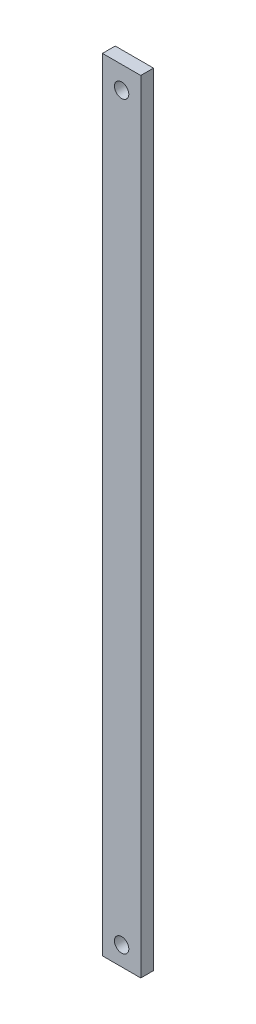
ISO-10303-21;
HEADER;
FILE_DESCRIPTION(('STEP AP214'),'2;1');
FILE_NAME('part.step','',(''),(''),'','','');
FILE_SCHEMA(('AUTOMOTIVE_DESIGN { 1 0 10303 214 1 1 1 1 }'));
ENDSEC;
DATA;
#1=APPLICATION_CONTEXT('core data for automotive mechanical design processes');
#2=APPLICATION_PROTOCOL_DEFINITION('international standard','automotive_design',2000,#1);
#3=PRODUCT_CONTEXT('',#1,'mechanical');
#4=PRODUCT('Part','Part','',(#3));
#5=PRODUCT_RELATED_PRODUCT_CATEGORY('part','',(#4));
#6=PRODUCT_DEFINITION_FORMATION('','',#4);
#7=PRODUCT_DEFINITION_CONTEXT('part definition',#1,'design');
#8=PRODUCT_DEFINITION('design','',#6,#7);
#9=PRODUCT_DEFINITION_SHAPE('','',#8);
#10=(LENGTH_UNIT() NAMED_UNIT(*) SI_UNIT(.MILLI.,.METRE.));
#11=(NAMED_UNIT(*) PLANE_ANGLE_UNIT() SI_UNIT($,.RADIAN.));
#12=(NAMED_UNIT(*) SI_UNIT($,.STERADIAN.) SOLID_ANGLE_UNIT());
#13=UNCERTAINTY_MEASURE_WITH_UNIT(LENGTH_MEASURE(1.E-05),#10,'distance_accuracy_value','');
#14=(GEOMETRIC_REPRESENTATION_CONTEXT(3) GLOBAL_UNCERTAINTY_ASSIGNED_CONTEXT((#13)) GLOBAL_UNIT_ASSIGNED_CONTEXT((#10,
#11,#12)) REPRESENTATION_CONTEXT('',''));
#15=CARTESIAN_POINT('',(0.,0.,0.));
#16=DIRECTION('',(0.,0.,1.));
#17=DIRECTION('',(1.,0.,0.));
#18=AXIS2_PLACEMENT_3D('',#15,#16,#17);
#19=CARTESIAN_POINT('',(0.,0.,0.));
#20=DIRECTION('',(0.,0.,-1.));
#21=DIRECTION('',(-1.,0.,0.));
#22=AXIS2_PLACEMENT_3D('',#19,#20,#21);
#23=PLANE('',#22);
#24=CARTESIAN_POINT('',(8.25,238.,0.));
#25=CARTESIAN_POINT('',(8.25000287090614,238.03711210073,0.));
#26=CARTESIAN_POINT('',(8.24911578489817,238.074226085527,0.));
#27=CARTESIAN_POINT('',(8.24554467484645,238.148103928321,0.));
#28=CARTESIAN_POINT('',(8.24287341102427,238.184868405459,0.));
#29=CARTESIAN_POINT('',(8.23573462791084,238.258047699601,0.));
#30=CARTESIAN_POINT('',(8.23127566323488,238.294463347968,0.));
#31=CARTESIAN_POINT('',(8.22056672731365,238.366944561543,0.));
#32=CARTESIAN_POINT('',(8.21432091396728,238.403010740813,0.));
#33=CARTESIAN_POINT('',(8.20004247191825,238.474793377988,0.));
#34=CARTESIAN_POINT('',(8.19200957098616,238.510509781747,0.));
#35=CARTESIAN_POINT('',(8.17416159650008,238.5815936297,0.));
#36=CARTESIAN_POINT('',(8.16434191407373,238.616959916075,0.));
#37=CARTESIAN_POINT('',(8.14292421865261,238.687344604515,0.));
#38=CARTESIAN_POINT('',(8.13131747701691,238.722360348466,0.));
#39=CARTESIAN_POINT('',(8.10633144178983,238.792045947027,0.));
#40=CARTESIAN_POINT('',(8.09293964424512,238.826711312357,0.));
#41=CARTESIAN_POINT('',(8.06454006705624,238.895311438424,0.));
#42=CARTESIAN_POINT('',(8.04953479968317,238.92924723903,0.));
#43=CARTESIAN_POINT('',(8.01799013304355,238.99611117842,0.));
#44=CARTESIAN_POINT('',(8.00146210911647,239.02904467768,0.));
#45=CARTESIAN_POINT('',(7.96687764173627,239.093905522552,0.));
#46=CARTESIAN_POINT('',(7.94882855829296,239.125836791035,0.));
#47=CARTESIAN_POINT('',(7.91120560897921,239.188694601239,0.));
#48=CARTESIAN_POINT('',(7.89163512149589,239.219623164542,0.));
#49=CARTESIAN_POINT('',(7.85097346813862,239.280477572315,0.));
#50=CARTESIAN_POINT('',(7.82988184069663,239.310403108362,0.));
#51=CARTESIAN_POINT('',(7.78618182500541,239.369253961589,0.));
#52=CARTESIAN_POINT('',(7.76356939515893,239.398176276876,0.));
#53=CARTESIAN_POINT('',(7.7168308634221,239.455023101906,0.));
#54=CARTESIAN_POINT('',(7.69269749744769,239.482941636499,0.));
#55=CARTESIAN_POINT('',(7.64292190997976,239.53778521661,0.));
#56=CARTESIAN_POINT('',(7.61726965377244,239.564701146949,0.));
#57=CARTESIAN_POINT('',(7.5647652379527,239.617224971904,0.));
#58=CARTESIAN_POINT('',(7.53791567096607,239.642835457821,0.));
#59=CARTESIAN_POINT('',(7.48318459423319,239.692538178883,0.));
#60=CARTESIAN_POINT('',(7.45531154398212,239.716639721036,0.));
#61=CARTESIAN_POINT('',(7.39853846059551,239.76332839421,0.));
#62=CARTESIAN_POINT('',(7.36964372575687,239.785921965796,0.));
#63=CARTESIAN_POINT('',(7.31083001866806,239.829597339041,0.));
#64=CARTESIAN_POINT('',(7.280913394046,239.850682301281,0.));
#65=CARTESIAN_POINT('',(7.22005894888905,239.891343899786,0.));
#66=CARTESIAN_POINT('',(7.18912081995047,239.910920074472,0.));
#67=CARTESIAN_POINT('',(7.12622602396911,239.948567901838,0.));
#68=CARTESIAN_POINT('',(7.09426677174845,239.966635234479,0.));
#69=CARTESIAN_POINT('',(7.0293316606141,240.001268790702,0.));
#70=CARTESIAN_POINT('',(6.99635137715341,240.017826714125,0.));
#71=CARTESIAN_POINT('',(6.92937700123519,240.049447282664,0.));
#72=CARTESIAN_POINT('',(6.89537712613848,240.064497666334,0.));
#73=CARTESIAN_POINT('',(6.82676937336938,240.092930783108,0.));
#74=CARTESIAN_POINT('',(6.79216289932262,240.106316902417,0.));
#75=CARTESIAN_POINT('',(6.72257756984626,240.131291552819,0.));
#76=CARTESIAN_POINT('',(6.68760296833329,240.142891919775,0.));
#77=CARTESIAN_POINT('',(6.61728449689123,240.164300510904,0.));
#78=CARTESIAN_POINT('',(6.58194305725306,240.174116712953,0.));
#79=CARTESIAN_POINT('',(6.51089243529977,240.191960465071,0.));
#80=CARTESIAN_POINT('',(6.47518421240803,240.199991833533,0.));
#81=CARTESIAN_POINT('',(6.4034015159838,240.214270264204,0.));
#82=CARTESIAN_POINT('',(6.36732693416212,240.220516781947,0.));
#83=CARTESIAN_POINT('',(6.29481251965567,240.23123004269,0.));
#84=CARTESIAN_POINT('',(6.25837195178599,240.235691805188,0.));
#85=CARTESIAN_POINT('',(6.18512604349686,240.242839447711,0.));
#86=CARTESIAN_POINT('',(6.14831979166278,240.245515966187,0.));
#87=CARTESIAN_POINT('',(6.07434286884701,240.249099578209,0.));
#88=CARTESIAN_POINT('',(6.03717154765592,240.249993130735,0.));
#89=CARTESIAN_POINT('',(5.96290536637939,240.250006855051,0.));
#90=CARTESIAN_POINT('',(5.92581050723018,240.24913069243,0.));
#91=CARTESIAN_POINT('',(5.8519646606233,240.245575108041,0.));
#92=CARTESIAN_POINT('',(5.81521307388341,240.242908249088,0.));
#93=CARTESIAN_POINT('',(5.74205456422342,240.235777494242,0.));
#94=CARTESIAN_POINT('',(5.70564683359849,240.231321898977,0.));
#95=CARTESIAN_POINT('',(5.63317610989629,240.22061748046,0.));
#96=CARTESIAN_POINT('',(5.59711254197413,240.214372552101,0.));
#97=CARTESIAN_POINT('',(5.52532985910152,240.200094053302,0.));
#98=CARTESIAN_POINT('',(5.48961085246244,240.192059938402,0.));
#99=CARTESIAN_POINT('',(5.41851648169572,240.17420763569,0.));
#100=CARTESIAN_POINT('',(5.38314234430141,240.164384565151,0.));
#101=CARTESIAN_POINT('',(5.31273666442082,240.142958130193,0.));
#102=CARTESIAN_POINT('',(5.27770786240688,240.131345768047,0.));
#103=CARTESIAN_POINT('',(5.20799070859296,240.106346851108,0.));
#104=CARTESIAN_POINT('',(5.17330693800182,240.09294753722,0.));
#105=CARTESIAN_POINT('',(5.10468868109664,240.064539779675,0.));
#106=CARTESIAN_POINT('',(5.07075279288692,240.049534722941,0.));
#107=CARTESIAN_POINT('',(5.00388878988494,240.017990209252,0.));
#108=CARTESIAN_POINT('',(4.97095531384687,240.001462129491,0.));
#109=CARTESIAN_POINT('',(4.90609448588364,239.966877621453,0.));
#110=CARTESIAN_POINT('',(4.87416321122364,239.948828552863,0.));
#111=CARTESIAN_POINT('',(4.8113053965087,239.911205614395,0.));
#112=CARTESIAN_POINT('',(4.78037683485551,239.891635122947,0.));
#113=CARTESIAN_POINT('',(4.71952242829024,239.850973466685,0.));
#114=CARTESIAN_POINT('',(4.68959689180065,239.829881840306,0.));
#115=CARTESIAN_POINT('',(4.63074603824958,239.786181825395,0.));
#116=CARTESIAN_POINT('',(4.60182372308062,239.763569395263,0.));
#117=CARTESIAN_POINT('',(4.54497689813882,239.716830863316,0.));
#118=CARTESIAN_POINT('',(4.51705836351321,239.692697497419,0.));
#119=CARTESIAN_POINT('',(4.46221478337795,239.642921910008,0.));
#120=CARTESIAN_POINT('',(4.43529885304788,239.61726965378,0.));
#121=CARTESIAN_POINT('',(4.38277502809922,239.564765237945,0.));
#122=CARTESIAN_POINT('',(4.35716454217892,239.537915670964,0.));
#123=CARTESIAN_POINT('',(4.30746182111449,239.483184594235,0.));
#124=CARTESIAN_POINT('',(4.28336027896206,239.455311543982,0.));
#125=CARTESIAN_POINT('',(4.23667160578767,239.398538460595,0.));
#126=CARTESIAN_POINT('',(4.21407803420168,239.369643725756,0.));
#127=CARTESIAN_POINT('',(4.17040266095661,239.310830018668,0.));
#128=CARTESIAN_POINT('',(4.14931769871595,239.280913394046,0.));
#129=CARTESIAN_POINT('',(4.10865610021102,239.220058948889,0.));
#130=CARTESIAN_POINT('',(4.08907992552584,239.18912081995,0.));
#131=CARTESIAN_POINT('',(4.05143209815946,239.126226023969,0.));
#132=CARTESIAN_POINT('',(4.03336476551906,239.094266771748,0.));
#133=CARTESIAN_POINT('',(3.99873120929612,239.029331660614,0.));
#134=CARTESIAN_POINT('',(3.98217328587373,238.996351377153,0.));
#135=CARTESIAN_POINT('',(3.95055271733512,238.929377001235,0.));
#136=CARTESIAN_POINT('',(3.93550233366577,238.895377126138,0.));
#137=CARTESIAN_POINT('',(3.90706921689241,238.826769373369,0.));
#138=CARTESIAN_POINT('',(3.89368309758285,238.792162899321,0.));
#139=CARTESIAN_POINT('',(3.86870844718104,238.722577569844,0.));
#140=CARTESIAN_POINT('',(3.85710808022563,238.687602968331,0.));
#141=CARTESIAN_POINT('',(3.83569948909653,238.617284496888,0.));
#142=CARTESIAN_POINT('',(3.82588328704712,238.581943057249,0.));
#143=CARTESIAN_POINT('',(3.80803953493,238.510892435296,0.));
#144=CARTESIAN_POINT('',(3.80000816646727,238.475184212404,0.));
#145=CARTESIAN_POINT('',(3.78572973579673,238.40340151598,0.));
#146=CARTESIAN_POINT('',(3.77948321805338,238.367326934158,0.));
#147=CARTESIAN_POINT('',(3.76876995731007,238.294812519652,0.));
#148=CARTESIAN_POINT('',(3.76430819481213,238.258371951783,0.));
#149=CARTESIAN_POINT('',(3.75716055228951,238.185126043494,0.));
#150=CARTESIAN_POINT('',(3.75448403381372,238.14831979166,0.));
#151=CARTESIAN_POINT('',(3.75090042179132,238.074342868846,0.));
#152=CARTESIAN_POINT('',(3.7500068692647,238.037171547655,0.));
#153=CARTESIAN_POINT('',(3.74999314494893,237.96290536638,0.));
#154=CARTESIAN_POINT('',(3.75086930756954,237.925810507232,0.));
#155=CARTESIAN_POINT('',(3.75442489195828,237.851964660626,0.));
#156=CARTESIAN_POINT('',(3.75709175091129,237.815213073887,0.));
#157=CARTESIAN_POINT('',(3.76422250575754,237.742054564228,0.));
#158=CARTESIAN_POINT('',(3.76867810102263,237.705646833603,0.));
#159=CARTESIAN_POINT('',(3.77938251953928,237.633176109902,0.));
#160=CARTESIAN_POINT('',(3.7856274478984,237.59711254198,0.));
#161=CARTESIAN_POINT('',(3.79990594669756,237.525329859107,0.));
#162=CARTESIAN_POINT('',(3.80794006159763,237.489610852468,0.));
#163=CARTESIAN_POINT('',(3.82579236430959,237.418516481701,0.));
#164=CARTESIAN_POINT('',(3.83561543484844,237.383142344306,0.));
#165=CARTESIAN_POINT('',(3.85704186980664,237.312736664424,0.));
#166=CARTESIAN_POINT('',(3.8686542319527,237.27770786241,0.));
#167=CARTESIAN_POINT('',(3.89365314889136,237.207990708595,0.));
#168=CARTESIAN_POINT('',(3.90705246277957,237.173306938003,0.));
#169=CARTESIAN_POINT('',(3.93546022032439,237.104688681097,0.));
#170=CARTESIAN_POINT('',(3.95046527705895,237.070752792887,0.));
#171=CARTESIAN_POINT('',(3.98200979074707,237.003888789885,0.));
#172=CARTESIAN_POINT('',(3.99853787050825,236.970955313846,0.));
#173=CARTESIAN_POINT('',(4.03312237854534,236.906094485883,0.));
#174=CARTESIAN_POINT('',(4.05117144713604,236.874163211223,0.));
#175=CARTESIAN_POINT('',(4.08879438560329,236.811305396508,0.));
#176=CARTESIAN_POINT('',(4.10836487705205,236.780376834855,0.));
#177=CARTESIAN_POINT('',(4.14902653331364,236.71952242829,0.));
#178=CARTESIAN_POINT('',(4.17011815969299,236.6895968918,0.));
#179=CARTESIAN_POINT('',(4.21381817460366,236.630746038249,0.));
#180=CARTESIAN_POINT('',(4.23643060473597,236.60182372308,0.));
#181=CARTESIAN_POINT('',(4.28316913668336,236.544976898138,0.));
#182=CARTESIAN_POINT('',(4.30730250258062,236.517058363513,0.));
#183=CARTESIAN_POINT('',(4.35707808999161,236.462214783378,0.));
#184=CARTESIAN_POINT('',(4.38273034621989,236.435298853048,0.));
#185=CARTESIAN_POINT('',(4.43523476205487,236.3827750281,0.));
#186=CARTESIAN_POINT('',(4.46208432903583,236.35716454218,0.));
#187=CARTESIAN_POINT('',(4.51681540576454,236.307461821116,0.));
#188=CARTESIAN_POINT('',(4.54468845601705,236.283360278964,0.));
#189=CARTESIAN_POINT('',(4.60146153940467,236.23667160579,0.));
#190=CARTESIAN_POINT('',(4.63035627424287,236.214078034204,0.));
#191=CARTESIAN_POINT('',(4.68916998133137,236.170402660959,0.));
#192=CARTESIAN_POINT('',(4.71908660595352,236.149317698719,0.));
#193=CARTESIAN_POINT('',(4.77994105111055,236.108656100214,0.));
#194=CARTESIAN_POINT('',(4.81087918004912,236.089079925529,0.));
#195=CARTESIAN_POINT('',(4.87377397603048,236.051432098162,0.));
#196=CARTESIAN_POINT('',(4.90573322825118,236.033364765521,0.));
#197=CARTESIAN_POINT('',(4.97066833938562,235.998731209298,0.));
#198=CARTESIAN_POINT('',(5.00364862284635,235.982173285875,0.));
#199=CARTESIAN_POINT('',(5.07062299876467,235.950552717336,0.));
#200=CARTESIAN_POINT('',(5.10462287386145,235.935502333666,0.));
#201=CARTESIAN_POINT('',(5.17323062663059,235.907069216892,0.));
#202=CARTESIAN_POINT('',(5.20783710067732,235.893683097583,0.));
#203=CARTESIAN_POINT('',(5.27742243015363,235.868708447181,0.));
#204=CARTESIAN_POINT('',(5.31239703166659,235.857108080225,0.));
#205=CARTESIAN_POINT('',(5.38271550310862,235.835699489096,0.));
#206=CARTESIAN_POINT('',(5.41805694274678,235.825883287047,0.));
#207=CARTESIAN_POINT('',(5.48910756470005,235.808039534929,0.));
#208=CARTESIAN_POINT('',(5.52481578759179,235.800008166467,0.));
#209=CARTESIAN_POINT('',(5.59659848401602,235.785729735796,0.));
#210=CARTESIAN_POINT('',(5.6326730658377,235.779483218053,0.));
#211=CARTESIAN_POINT('',(5.70518748034417,235.768769957309,0.));
#212=CARTESIAN_POINT('',(5.74162804821386,235.764308194812,0.));
#213=CARTESIAN_POINT('',(5.81487395650302,235.757160552289,0.));
#214=CARTESIAN_POINT('',(5.85168020833712,235.754484033813,0.));
#215=CARTESIAN_POINT('',(5.92565713115294,235.750900421791,0.));
#216=CARTESIAN_POINT('',(5.96282845234406,235.750006869265,0.));
#217=CARTESIAN_POINT('',(6.03709463362064,235.749993144949,0.));
#218=CARTESIAN_POINT('',(6.07418949276988,235.75086930757,0.));
#219=CARTESIAN_POINT('',(6.1480353393768,235.754424891959,0.));
#220=CARTESIAN_POINT('',(6.18478692611671,235.757091750912,0.));
#221=CARTESIAN_POINT('',(6.25794543577673,235.764222505758,0.));
#222=CARTESIAN_POINT('',(6.29435316640168,235.768678101023,0.));
#223=CARTESIAN_POINT('',(6.36682389010389,235.77938251954,0.));
#224=CARTESIAN_POINT('',(6.40288745802605,235.785627447899,0.));
#225=CARTESIAN_POINT('',(6.47467014089866,235.799905946698,0.));
#226=CARTESIAN_POINT('',(6.51038914753774,235.807940061598,0.));
#227=CARTESIAN_POINT('',(6.58148351830444,235.82579236431,0.));
#228=CARTESIAN_POINT('',(6.61685765569874,235.835615434849,0.));
#229=CARTESIAN_POINT('',(6.6872633355793,235.857041869807,0.));
#230=CARTESIAN_POINT('',(6.72229213759322,235.868654231953,0.));
#231=CARTESIAN_POINT('',(6.7920092914071,235.893653148892,0.));
#232=CARTESIAN_POINT('',(6.82669306199821,235.90705246278,0.));
#233=CARTESIAN_POINT('',(6.89531131890343,235.935460220325,0.));
#234=CARTESIAN_POINT('',(6.92924720711321,235.950465277059,0.));
#235=CARTESIAN_POINT('',(6.9961112101153,235.982009790748,0.));
#236=CARTESIAN_POINT('',(7.02904468615341,235.998537870509,0.));
#237=CARTESIAN_POINT('',(7.09390551411673,236.033122378547,0.));
#238=CARTESIAN_POINT('',(7.12583678877677,236.051171447138,0.));
#239=CARTESIAN_POINT('',(7.18869460349172,236.088794385605,0.));
#240=CARTESIAN_POINT('',(7.21962316514488,236.108364877054,0.));
#241=CARTESIAN_POINT('',(7.28047757171023,236.149026533315,0.));
#242=CARTESIAN_POINT('',(7.31040310819992,236.170118159695,0.));
#243=CARTESIAN_POINT('',(7.36925396175067,236.213818174605,0.));
#244=CARTESIAN_POINT('',(7.39817627691921,236.236430604738,0.));
#245=CARTESIAN_POINT('',(7.45502310186202,236.283169136684,0.));
#246=CARTESIAN_POINT('',(7.48294163648907,236.307302502581,0.));
#247=CARTESIAN_POINT('',(7.53778521662012,236.357078089993,0.));
#248=CARTESIAN_POINT('',(7.56470114694449,236.382730346223,0.));
#249=CARTESIAN_POINT('',(7.61722497190853,236.435234762052,0.));
#250=CARTESIAN_POINT('',(7.64283545784985,236.462084329024,0.));
#251=CARTESIAN_POINT('',(7.69253817885731,236.516815405777,0.));
#252=CARTESIAN_POINT('',(7.71663972093245,236.544688456062,0.));
#253=CARTESIAN_POINT('',(7.76332839431798,236.601461539362,0.));
#254=CARTESIAN_POINT('',(7.78592196619072,236.630356274081,0.));
#255=CARTESIAN_POINT('',(7.82959733865265,236.689169981496,0.));
#256=CARTESIAN_POINT('',(7.85068229982634,236.719086606563,0.));
#257=CARTESIAN_POINT('',(7.89134390124801,236.779941050504,0.));
#258=CARTESIAN_POINT('',(7.91092007991842,236.810879177781,0.));
#259=CARTESIAN_POINT('',(7.94856789638201,236.873773978307,0.));
#260=CARTESIAN_POINT('',(7.96663521408206,236.905733236756,0.));
#261=CARTESIAN_POINT('',(8.00126881120956,236.970668330838,0.));
#262=CARTESIAN_POINT('',(8.01782679084562,237.003648590865,0.));
#263=CARTESIAN_POINT('',(8.04944720536544,237.07062303099,0.));
#264=CARTESIAN_POINT('',(8.06449737678316,237.104622994569,0.));
#265=CARTESIAN_POINT('',(8.09293869342754,237.173248895732,0.));
#266=CARTESIAN_POINT('',(8.10633234760243,237.207873793327,0.));
#267=CARTESIAN_POINT('',(8.13131991132419,237.277490710935,0.));
#268=CARTESIAN_POINT('',(8.14292591378431,237.312478384325,0.));
#269=CARTESIAN_POINT('',(8.16434326086852,237.38281786713,0.));
#270=CARTESIAN_POINT('',(8.17416285334048,237.418167163655,0.));
#271=CARTESIAN_POINT('',(8.1920109593673,237.4892283254,0.));
#272=CARTESIAN_POINT('',(8.20004356565134,237.524939162128,0.));
#273=CARTESIAN_POINT('',(8.21432199538565,237.596721881922,0.));
#274=CARTESIAN_POINT('',(8.22056754658719,237.632793819135,0.));
#275=CARTESIAN_POINT('',(8.23127649541571,237.705297816986,0.));
#276=CARTESIAN_POINT('',(8.23573517584225,237.741730574013,0.));
#277=CARTESIAN_POINT('',(8.24287396106473,237.814955361654,0.));
#278=CARTESIAN_POINT('',(8.24554495065087,237.851748277374,0.));
#279=CARTESIAN_POINT('',(8.24911604897124,237.925694355649,0.));
#280=CARTESIAN_POINT('',(8.25000285009063,237.962848163429,0.));
#281=CARTESIAN_POINT('',(8.25,238.,0.));
#282=B_SPLINE_CURVE_WITH_KNOTS('',3,(#24,#25,#26,#27,#28,#29,#30,#31,#32,#33,#34,#35,#36,#37,
#38,#39,#40,#41,#42,#43,#44,#45,#46,#47,#48,#49,#50,#51,#52,#53,#54,#55,#56,#57,#58,#59,#60,#61,
#62,#63,#64,#65,#66,#67,#68,#69,#70,#71,#72,#73,#74,#75,#76,#77,#78,#79,#80,#81,#82,#83,#84,#85,
#86,#87,#88,#89,#90,#91,#92,#93,#94,#95,#96,#97,#98,#99,#100,#101,#102,#103,#104,#105,#106,#107,
#108,#109,#110,#111,#112,#113,#114,#115,#116,#117,#118,#119,#120,#121,#122,#123,#124,#125,#126,
#127,#128,#129,#130,#131,#132,#133,#134,#135,#136,#137,#138,#139,#140,#141,#142,#143,#144,#145,
#146,#147,#148,#149,#150,#151,#152,#153,#154,#155,#156,#157,#158,#159,#160,#161,#162,#163,#164,
#165,#166,#167,#168,#169,#170,#171,#172,#173,#174,#175,#176,#177,#178,#179,#180,#181,#182,#183,
#184,#185,#186,#187,#188,#189,#190,#191,#192,#193,#194,#195,#196,#197,#198,#199,#200,#201,#202,
#203,#204,#205,#206,#207,#208,#209,#210,#211,#212,#213,#214,#215,#216,#217,#218,#219,#220,#221,
#222,#223,#224,#225,#226,#227,#228,#229,#230,#231,#232,#233,#234,#235,#236,#237,#238,#239,#240,
#241,#242,#243,#244,#245,#246,#247,#248,#249,#250,#251,#252,#253,#254,#255,#256,#257,#258,#259,
#260,#261,#262,#263,#264,#265,#266,#267,#268,#269,#270,#271,#272,#273,#274,#275,#276,#277,#278,
#279,#280,#281),.UNSPECIFIED.,.F.,.F.,(4,2,2,2,2,2,2,2,2,2,2,2,2,2,2,2,2,2,2,2,2,2,2,2,2,2,2,2,
2,2,2,2,2,2,2,2,2,2,2,2,2,2,2,2,2,2,2,2,2,2,2,2,2,2,2,2,2,2,2,2,2,2,2,2,2,2,2,2,2,2,2,2,2,2,2,2,
2,2,2,2,2,2,2,2,2,2,2,2,2,2,2,2,2,2,2,2,2,2,2,2,2,2,2,2,2,2,2,2,2,2,2,2,2,2,2,2,2,2,2,2,2,2,2,2,
2,2,2,2,4),(0.,0.1113283365683,0.221868872492235,0.331886638885796,0.441650453700678,
0.551431000446369,0.66149883918899,0.772122422062305,0.883566185147609,0.994838869649577,
1.10533895411645,1.2153320832451,1.32508758279417,1.43487652733979,1.54496974441078,
1.65563582766605,1.76713923101552,1.87841191551435,1.98891199997901,2.09890512910632,
2.20866062865495,2.31844957320101,2.42854279027329,2.5392088735307,2.65071227688306,
2.76198496138188,2.87248504584644,2.98247817497369,3.09223367452229,3.20202261906839,
3.31211583614081,3.42278191939849,3.5342853227513,3.6455580072548,3.75605809172274,
3.86605122085203,3.97580672040131,4.08559566494672,4.1956888820171,4.30635496527136,
4.41785836861944,4.52913105312126,4.63963113758803,4.74962426671665,4.85937976626569,
4.96916871081133,5.07926192788231,5.18992801113757,5.30143141448694,5.41270409898669,
5.52320418345191,5.63319731257956,5.74295281212832,5.85274175667428,5.96283497374622,
6.0735010570032,6.18500446035498,6.29627714485545,6.40677722932116,6.51677035844917,
6.62652585799803,6.73631480254385,6.84640801961551,6.95707410287188,7.06857750622284,
7.17985019072387,7.29035027519007,7.40034340431831,7.51009890386724,7.61988784841299,
7.72998106548443,7.84064714874039,7.95215055209085,8.06342323659267,8.17392332105945,
8.28391645018799,8.39367194973706,8.50346089428271,8.61355411135377,8.72422019460914,
8.83572359795875,8.94699628245736,9.05749636692186,9.16748949604908,9.27724499559766,
9.38703394014375,9.49712715721613,9.6077932404737,9.7192966438263,9.83056932832504,
9.94106941278954,10.0510625419168,10.1608180414653,10.2706069860115,10.3807002030839,
10.4913662863417,10.6028696896945,10.7141423741981,10.8246424586661,10.9346355877955,
11.0443910873447,11.1541800318901,11.2642732489605,11.3749393322147,11.4864427355627,
11.5977154200647,11.7082155045317,11.8182086336604,11.9279641332095,12.0377530777551,
12.1478462948259,12.2585123780811,12.3700157814302,12.4812884659303,12.5917885503957,
12.7017816795235,12.8115371790723,12.9213261236183,13.0314193406901,13.1420854239468,
13.2535888272982,13.3649212247035,13.4754638606304,13.5854823979006,13.6952463048474,
13.8050269248723,13.915095477773,14.0257210655995,14.1371687554184),.UNSPECIFIED.);
#283=CARTESIAN_POINT('',(8.25,238.,0.));
#284=VERTEX_POINT('',#283);
#285=EDGE_CURVE('E121',#284,#284,#282,.T.);
#286=ORIENTED_EDGE('',*,*,#285,.T.);
#287=EDGE_LOOP('',(#286));
#288=FACE_BOUND('',#287,.T.);
#289=DIRECTION('',(0.,-1.,0.));
#290=VECTOR('',#289,1.);
#291=CARTESIAN_POINT('',(0.,0.,0.));
#292=LINE('',#291,#290);
#293=CARTESIAN_POINT('',(0.,245.,0.));
#294=VERTEX_POINT('',#293);
#295=CARTESIAN_POINT('',(0.,0.,0.));
#296=VERTEX_POINT('',#295);
#297=EDGE_CURVE('E112',#294,#296,#292,.T.);
#298=ORIENTED_EDGE('',*,*,#297,.F.);
#299=DIRECTION('',(-1.,0.,0.));
#300=VECTOR('',#299,1.);
#301=CARTESIAN_POINT('',(0.,245.,0.));
#302=LINE('',#301,#300);
#303=CARTESIAN_POINT('',(12.,245.,0.));
#304=VERTEX_POINT('',#303);
#305=EDGE_CURVE('E88',#304,#294,#302,.T.);
#306=ORIENTED_EDGE('',*,*,#305,.F.);
#307=DIRECTION('',(0.,1.,0.));
#308=VECTOR('',#307,1.);
#309=CARTESIAN_POINT('',(12.,0.,0.));
#310=LINE('',#309,#308);
#311=CARTESIAN_POINT('',(12.,0.,0.));
#312=VERTEX_POINT('',#311);
#313=EDGE_CURVE('E78',#312,#304,#310,.T.);
#314=ORIENTED_EDGE('',*,*,#313,.F.);
#315=DIRECTION('',(1.,0.,0.));
#316=VECTOR('',#315,1.);
#317=CARTESIAN_POINT('',(0.,0.,0.));
#318=LINE('',#317,#316);
#319=EDGE_CURVE('E105',#296,#312,#318,.T.);
#320=ORIENTED_EDGE('',*,*,#319,.F.);
#321=EDGE_LOOP('',(#298,#306,#314,#320));
#322=FACE_BOUND('',#321,.T.);
#323=CARTESIAN_POINT('',(8.25,6.,0.));
#324=CARTESIAN_POINT('',(8.25000287090614,6.03711210072944,0.));
#325=CARTESIAN_POINT('',(8.24911578489817,6.07422608552689,0.));
#326=CARTESIAN_POINT('',(8.24554467484644,6.14810392831943,0.));
#327=CARTESIAN_POINT('',(8.24287341102427,6.18486840545785,0.));
#328=CARTESIAN_POINT('',(8.23573462791083,6.25804769959985,0.));
#329=CARTESIAN_POINT('',(8.23127566323488,6.29446334796642,0.));
#330=CARTESIAN_POINT('',(8.22056672731365,6.36694456154111,0.));
#331=CARTESIAN_POINT('',(8.21432091396727,6.40301074081053,0.));
#332=CARTESIAN_POINT('',(8.20004247191824,6.47479337798632,0.));
#333=CARTESIAN_POINT('',(8.19200957098616,6.51050978174459,0.));
#334=CARTESIAN_POINT('',(8.17416159650007,6.58159362969806,0.));
#335=CARTESIAN_POINT('',(8.16434191407372,6.61695991607356,0.));
#336=CARTESIAN_POINT('',(8.14292421865259,6.68734460451372,0.));
#337=CARTESIAN_POINT('',(8.1313174770169,6.72236034846454,0.));
#338=CARTESIAN_POINT('',(8.10633144178983,6.79204594702621,0.));
#339=CARTESIAN_POINT('',(8.09293964424513,6.82671131235653,0.));
#340=CARTESIAN_POINT('',(8.06454006705656,6.89531143842399,0.));
#341=CARTESIAN_POINT('',(8.04953479968382,6.92924723902928,0.));
#342=CARTESIAN_POINT('',(8.01799013304477,6.9961111784185,0.));
#343=CARTESIAN_POINT('',(8.00146210911791,7.02904467767761,0.));
#344=CARTESIAN_POINT('',(7.96687764173807,7.09390552254956,0.));
#345=CARTESIAN_POINT('',(7.94882855829491,7.12583679103225,0.));
#346=CARTESIAN_POINT('',(7.91120560898134,7.18869460123596,0.));
#347=CARTESIAN_POINT('',(7.89163512149806,7.2196231645383,0.));
#348=CARTESIAN_POINT('',(7.85097346814079,7.28047757231147,0.));
#349=CARTESIAN_POINT('',(7.82988184069875,7.31040310835917,0.));
#350=CARTESIAN_POINT('',(7.78618182500734,7.36925396158581,0.));
#351=CARTESIAN_POINT('',(7.76356939516072,7.39817627687378,0.));
#352=CARTESIAN_POINT('',(7.71683086342353,7.45502310190355,0.));
#353=CARTESIAN_POINT('',(7.69269749744889,7.48294163649731,0.));
#354=CARTESIAN_POINT('',(7.64292190998041,7.53778521660948,0.));
#355=CARTESIAN_POINT('',(7.61726965377275,7.56470114694859,0.));
#356=CARTESIAN_POINT('',(7.56476523795243,7.61722497190401,0.));
#357=CARTESIAN_POINT('',(7.53791567096554,7.64283545782205,0.));
#358=CARTESIAN_POINT('',(7.48318459423219,7.6925381788849,0.));
#359=CARTESIAN_POINT('',(7.45531154398091,7.71663972103799,0.));
#360=CARTESIAN_POINT('',(7.39853846059397,7.76332839421291,0.));
#361=CARTESIAN_POINT('',(7.36964372575523,7.78592196579876,0.));
#362=CARTESIAN_POINT('',(7.31083001866625,7.82959733904374,0.));
#363=CARTESIAN_POINT('',(7.28091339404416,7.85068230128446,0.));
#364=CARTESIAN_POINT('',(7.2200589488872,7.89134389978943,0.));
#365=CARTESIAN_POINT('',(7.18912081994866,7.91092007447459,0.));
#366=CARTESIAN_POINT('',(7.12622602396746,7.94856790184092,0.));
#367=CARTESIAN_POINT('',(7.09426677174692,7.96663523448129,0.));
#368=CARTESIAN_POINT('',(7.02933166061288,8.00126879070416,0.));
#369=CARTESIAN_POINT('',(6.9963513771524,8.01782671412651,0.));
#370=CARTESIAN_POINT('',(6.92937700123464,8.04944728266501,0.));
#371=CARTESIAN_POINT('',(6.8953771261382,8.06449766633429,0.));
#372=CARTESIAN_POINT('',(6.82676937336886,8.09293078310758,0.));
#373=CARTESIAN_POINT('',(6.79216289932157,8.10631690241713,0.));
#374=CARTESIAN_POINT('',(6.72257756984432,8.13129155281892,0.));
#375=CARTESIAN_POINT('',(6.68760296833097,8.14289191977431,0.));
#376=CARTESIAN_POINT('',(6.61728449688833,8.16430051090339,0.));
#377=CARTESIAN_POINT('',(6.58194305724994,8.1741167129528,0.));
#378=CARTESIAN_POINT('',(6.51089243529636,8.19196046506992,0.));
#379=CARTESIAN_POINT('',(6.47518421240454,8.19999183353264,0.));
#380=CARTESIAN_POINT('',(6.40340151598031,8.21427026420318,0.));
#381=CARTESIAN_POINT('',(6.36732693415871,8.22051678194653,0.));
#382=CARTESIAN_POINT('',(6.29481251965256,8.23123004268985,0.));
#383=CARTESIAN_POINT('',(6.2583719517831,8.23569180518779,0.));
#384=CARTESIAN_POINT('',(6.18512604349457,8.24283944771043,0.));
#385=CARTESIAN_POINT('',(6.14831979166085,8.24551596618623,0.));
#386=CARTESIAN_POINT('',(6.07434286884597,8.24909957820866,0.));
#387=CARTESIAN_POINT('',(6.0371715476554,8.24999313073529,0.));
#388=CARTESIAN_POINT('',(5.96290536638057,8.25000685505107,0.));
#389=CARTESIAN_POINT('',(5.92581050723252,8.24913069243048,0.));
#390=CARTESIAN_POINT('',(5.85196466062766,8.24557510804177,0.));
#391=CARTESIAN_POINT('',(5.8152130738886,8.24290824908877,0.));
#392=CARTESIAN_POINT('',(5.74205456422994,8.23577749424253,0.));
#393=CARTESIAN_POINT('',(5.70564683360552,8.23132189897745,0.));
#394=CARTESIAN_POINT('',(5.63317610990399,8.22061748046081,0.));
#395=CARTESIAN_POINT('',(5.597112541982,8.21437255210168,0.));
#396=CARTESIAN_POINT('',(5.52532985910939,8.20009405330252,0.));
#397=CARTESIAN_POINT('',(5.48961085247015,8.19205993840245,0.));
#398=CARTESIAN_POINT('',(5.41851648170276,8.17420763569048,0.));
#399=CARTESIAN_POINT('',(5.38314234430795,8.16438456515162,0.));
#400=CARTESIAN_POINT('',(5.31273666442603,8.1429581301934,0.));
#401=CARTESIAN_POINT('',(5.27770786241126,8.13134576804733,0.));
#402=CARTESIAN_POINT('',(5.20799070859532,8.10634685110866,0.));
#403=CARTESIAN_POINT('',(5.17330693800299,8.09294753722045,0.));
#404=CARTESIAN_POINT('',(5.10468868109702,8.06453977967593,0.));
#405=CARTESIAN_POINT('',(5.07075279288765,8.04953472294171,0.));
#406=CARTESIAN_POINT('',(5.00388878988628,8.01799020925415,0.));
#407=CARTESIAN_POINT('',(4.97095531384848,8.00146212949319,0.));
#408=CARTESIAN_POINT('',(4.90609448588567,7.96687762145647,0.));
#409=CARTESIAN_POINT('',(4.87416321122582,7.94882855286591,0.));
#410=CARTESIAN_POINT('',(4.81130539651109,7.91120561439885,0.));
#411=CARTESIAN_POINT('',(4.78037683485797,7.89163512295013,0.));
#412=CARTESIAN_POINT('',(4.7195224282927,7.85097346668854,0.));
#413=CARTESIAN_POINT('',(4.68959689180305,7.82988184030914,0.));
#414=CARTESIAN_POINT('',(4.63074603825177,7.78618182539828,0.));
#415=CARTESIAN_POINT('',(4.60182372308265,7.76356939526583,0.));
#416=CARTESIAN_POINT('',(4.54497689814043,7.71683086331807,0.));
#417=CARTESIAN_POINT('',(4.51705836351456,7.69269749742058,0.));
#418=CARTESIAN_POINT('',(4.46221478337867,7.64292191000904,0.));
#419=CARTESIAN_POINT('',(4.43529885304824,7.61726965378042,0.));
#420=CARTESIAN_POINT('',(4.38277502809919,7.56476523794482,0.));
#421=CARTESIAN_POINT('',(4.35716454217885,7.53791567096355,0.));
#422=CARTESIAN_POINT('',(4.30746182111435,7.48318459423431,0.));
#423=CARTESIAN_POINT('',(4.2833602789619,7.45531154398157,0.));
#424=CARTESIAN_POINT('',(4.23667160578747,7.39853846059358,0.));
#425=CARTESIAN_POINT('',(4.21407803420147,7.36964372575524,0.));
#426=CARTESIAN_POINT('',(4.17040266095637,7.31083001866657,0.));
#427=CARTESIAN_POINT('',(4.14931769871571,7.28091339404438,0.));
#428=CARTESIAN_POINT('',(4.10865610021077,7.22005894888735,0.));
#429=CARTESIAN_POINT('',(4.08907992552559,7.18912081994882,0.));
#430=CARTESIAN_POINT('',(4.05143209815924,7.12622602396763,0.));
#431=CARTESIAN_POINT('',(4.03336476551886,7.09426677174707,0.));
#432=CARTESIAN_POINT('',(3.99873120929596,7.029331660613,0.));
#433=CARTESIAN_POINT('',(3.98217328587359,6.99635137715249,0.));
#434=CARTESIAN_POINT('',(3.95055271733505,6.9293770012347,0.));
#435=CARTESIAN_POINT('',(3.93550233366574,6.89537712613823,0.));
#436=CARTESIAN_POINT('',(3.90706921689241,6.82676937336887,0.));
#437=CARTESIAN_POINT('',(3.89368309758285,6.79216289932158,0.));
#438=CARTESIAN_POINT('',(3.86870844718103,6.72257756984434,0.));
#439=CARTESIAN_POINT('',(3.85710808022563,6.687602968331,0.));
#440=CARTESIAN_POINT('',(3.83569948909653,6.61728449688836,0.));
#441=CARTESIAN_POINT('',(3.82588328704711,6.58194305724997,0.));
#442=CARTESIAN_POINT('',(3.80803953492999,6.51089243529639,0.));
#443=CARTESIAN_POINT('',(3.80000816646727,6.47518421240458,0.));
#444=CARTESIAN_POINT('',(3.78572973579673,6.40340151598035,0.));
#445=CARTESIAN_POINT('',(3.77948321805338,6.36732693415874,0.));
#446=CARTESIAN_POINT('',(3.76876995731007,6.29481251965259,0.));
#447=CARTESIAN_POINT('',(3.76430819481213,6.25837195178313,0.));
#448=CARTESIAN_POINT('',(3.75716055228951,6.18512604349459,0.));
#449=CARTESIAN_POINT('',(3.75448403381372,6.14831979166088,0.));
#450=CARTESIAN_POINT('',(3.75090042179132,6.07434286884599,0.));
#451=CARTESIAN_POINT('',(3.7500068692647,6.03717154765541,0.));
#452=CARTESIAN_POINT('',(3.74999314494894,5.96290536638045,0.));
#453=CARTESIAN_POINT('',(3.75086930756954,5.92581050723229,0.));
#454=CARTESIAN_POINT('',(3.75442489195828,5.85196466062723,0.));
#455=CARTESIAN_POINT('',(3.75709175091129,5.8152130738881,0.));
#456=CARTESIAN_POINT('',(3.76422250575754,5.74205456422931,0.));
#457=CARTESIAN_POINT('',(3.76867810102263,5.70564683360484,0.));
#458=CARTESIAN_POINT('',(3.77938251953928,5.63317610990325,0.));
#459=CARTESIAN_POINT('',(3.78562744789841,5.59711254198124,0.));
#460=CARTESIAN_POINT('',(3.79990594669757,5.52532985910863,0.));
#461=CARTESIAN_POINT('',(3.80794006159764,5.4896108524694,0.));
#462=CARTESIAN_POINT('',(3.8257923643096,5.41851648170208,0.));
#463=CARTESIAN_POINT('',(3.83561543484845,5.38314234430732,0.));
#464=CARTESIAN_POINT('',(3.85704186980665,5.31273666442552,0.));
#465=CARTESIAN_POINT('',(3.86865423195271,5.27770786241084,0.));
#466=CARTESIAN_POINT('',(3.89365314889137,5.20799070859509,0.));
#467=CARTESIAN_POINT('',(3.90705246277956,5.17330693800288,0.));
#468=CARTESIAN_POINT('',(3.93546022032411,5.104688681097,0.));
#469=CARTESIAN_POINT('',(3.95046527705837,5.07075279288763,0.));
#470=CARTESIAN_POINT('',(3.982009790746,5.00388878988625,0.));
#471=CARTESIAN_POINT('',(3.99853787050698,4.97095531384843,0.));
#472=CARTESIAN_POINT('',(4.03312237854375,4.90609448588561,0.));
#473=CARTESIAN_POINT('',(4.05117144713432,4.87416321122576,0.));
#474=CARTESIAN_POINT('',(4.0887943856014,4.81130539651102,0.));
#475=CARTESIAN_POINT('',(4.10836487705013,4.7803768348579,0.));
#476=CARTESIAN_POINT('',(4.14902653331172,4.71952242829263,0.));
#477=CARTESIAN_POINT('',(4.17011815969111,4.68959689180298,0.));
#478=CARTESIAN_POINT('',(4.21381817460195,4.6307460382517,0.));
#479=CARTESIAN_POINT('',(4.23643060473439,4.60182372308259,0.));
#480=CARTESIAN_POINT('',(4.2831691366821,4.54497689814038,0.));
#481=CARTESIAN_POINT('',(4.30730250257956,4.51705836351452,0.));
#482=CARTESIAN_POINT('',(4.35707808999104,4.46221478337865,0.));
#483=CARTESIAN_POINT('',(4.38273034621961,4.43529885304823,0.));
#484=CARTESIAN_POINT('',(4.4352347620551,4.38277502809925,0.));
#485=CARTESIAN_POINT('',(4.46208432903628,4.35716454217896,0.));
#486=CARTESIAN_POINT('',(4.51681540576537,4.30746182111456,0.));
#487=CARTESIAN_POINT('',(4.54468845601806,4.28336027896216,0.));
#488=CARTESIAN_POINT('',(4.60146153940595,4.23667160578779,0.));
#489=CARTESIAN_POINT('',(4.63035627424425,4.21407803420181,0.));
#490=CARTESIAN_POINT('',(4.68916998133287,4.17040266095675,0.));
#491=CARTESIAN_POINT('',(4.71908660595506,4.14931769871609,0.));
#492=CARTESIAN_POINT('',(4.77994105111209,4.10865610021115,0.));
#493=CARTESIAN_POINT('',(4.81087918005062,4.08907992552597,0.));
#494=CARTESIAN_POINT('',(4.87377397603186,4.05143209815958,0.));
#495=CARTESIAN_POINT('',(4.90573322825246,4.03336476551918,0.));
#496=CARTESIAN_POINT('',(4.97066833938663,3.99873120929622,0.));
#497=CARTESIAN_POINT('',(5.00364862284719,3.98217328587381,0.));
#498=CARTESIAN_POINT('',(5.07062299876513,3.95055271733516,0.));
#499=CARTESIAN_POINT('',(5.10462287386168,3.9355023336658,0.));
#500=CARTESIAN_POINT('',(5.17323062663108,3.90706921689241,0.));
#501=CARTESIAN_POINT('',(5.20783710067831,3.89368309758284,0.));
#502=CARTESIAN_POINT('',(5.27742243015546,3.86870844718103,0.));
#503=CARTESIAN_POINT('',(5.31239703166876,3.85710808022563,0.));
#504=CARTESIAN_POINT('',(5.38271550311134,3.83569948909653,0.));
#505=CARTESIAN_POINT('',(5.41805694274971,3.82588328704711,0.));
#506=CARTESIAN_POINT('',(5.48910756470325,3.80803953492999,0.));
#507=CARTESIAN_POINT('',(5.52481578759506,3.80000816646727,0.));
#508=CARTESIAN_POINT('',(5.59659848401929,3.78572973579673,0.));
#509=CARTESIAN_POINT('',(5.6326730658409,3.77948321805338,0.));
#510=CARTESIAN_POINT('',(5.70518748034709,3.76876995731006,0.));
#511=CARTESIAN_POINT('',(5.74162804821657,3.76430819481213,0.));
#512=CARTESIAN_POINT('',(5.81487395650517,3.7571605522895,0.));
#513=CARTESIAN_POINT('',(5.85168020833892,3.75448403381372,0.));
#514=CARTESIAN_POINT('',(5.92565713115391,3.75090042179132,0.));
#515=CARTESIAN_POINT('',(5.96282845234454,3.7500068692647,0.));
#516=CARTESIAN_POINT('',(6.03709463361949,3.74999314494894,0.));
#517=CARTESIAN_POINT('',(6.0741894927676,3.75086930756955,0.));
#518=CARTESIAN_POINT('',(6.14803533937256,3.75442489195828,0.));
#519=CARTESIAN_POINT('',(6.18478692611167,3.75709175091129,0.));
#520=CARTESIAN_POINT('',(6.25794543577039,3.76422250575755,0.));
#521=CARTESIAN_POINT('',(6.29435316639484,3.76867810102263,0.));
#522=CARTESIAN_POINT('',(6.3668238900964,3.77938251953928,0.));
#523=CARTESIAN_POINT('',(6.4028874580184,3.78562744789841,0.));
#524=CARTESIAN_POINT('',(6.47467014089101,3.79990594669757,0.));
#525=CARTESIAN_POINT('',(6.51038914753025,3.80794006159764,0.));
#526=CARTESIAN_POINT('',(6.58148351829759,3.8257923643096,0.));
#527=CARTESIAN_POINT('',(6.61685765569238,3.83561543484845,0.));
#528=CARTESIAN_POINT('',(6.68726333557424,3.85704186980666,0.));
#529=CARTESIAN_POINT('',(6.72229213758896,3.86865423195272,0.));
#530=CARTESIAN_POINT('',(6.7920092914048,3.89365314889137,0.));
#531=CARTESIAN_POINT('',(6.82669306199707,3.90705246277956,0.));
#532=CARTESIAN_POINT('',(6.89531131890296,3.93546022032407,0.));
#533=CARTESIAN_POINT('',(6.9292472071123,3.95046527705829,0.));
#534=CARTESIAN_POINT('',(6.99611121011361,3.98200979074585,0.));
#535=CARTESIAN_POINT('',(7.0290446861514,3.99853787050681,0.));
#536=CARTESIAN_POINT('',(7.09390551411418,4.03312237854353,0.));
#537=CARTESIAN_POINT('',(7.12583678877403,4.05117144713408,0.));
#538=CARTESIAN_POINT('',(7.18869460348872,4.08879438560115,0.));
#539=CARTESIAN_POINT('',(7.21962316514181,4.10836487704989,0.));
#540=CARTESIAN_POINT('',(7.28047757170716,4.14902653331145,0.));
#541=CARTESIAN_POINT('',(7.31040310819692,4.1701181596908,0.));
#542=CARTESIAN_POINT('',(7.36925396174793,4.21381817460179,0.));
#543=CARTESIAN_POINT('',(7.39817627691665,4.2364306047344,0.));
#544=CARTESIAN_POINT('',(7.45502310186,4.28316913668171,0.));
#545=CARTESIAN_POINT('',(7.48294163648738,4.30730250257857,0.));
#546=CARTESIAN_POINT('',(7.53778521661922,4.35707808999182,0.));
#547=CARTESIAN_POINT('',(7.56470114694404,4.38273034622278,0.));
#548=CARTESIAN_POINT('',(7.61722497190848,4.43523476205194,0.));
#549=CARTESIAN_POINT('',(7.64283545784976,4.46208432902443,0.));
#550=CARTESIAN_POINT('',(7.69253817885717,4.5168154057774,0.));
#551=CARTESIAN_POINT('',(7.71663972093228,4.54468845606236,0.));
#552=CARTESIAN_POINT('',(7.76332839431776,4.60146153936231,0.));
#553=CARTESIAN_POINT('',(7.78592196619048,4.63035627408111,0.));
#554=CARTESIAN_POINT('',(7.82959733865239,4.68916998149624,0.));
#555=CARTESIAN_POINT('',(7.85068229982608,4.71908660656323,0.));
#556=CARTESIAN_POINT('',(7.89134390124774,4.77994105050434,0.));
#557=CARTESIAN_POINT('',(7.91092007991817,4.81087917778151,0.));
#558=CARTESIAN_POINT('',(7.94856789638178,4.87377397830784,0.));
#559=CARTESIAN_POINT('',(7.96663521408183,4.90573323675671,0.));
#560=CARTESIAN_POINT('',(8.00126881120939,4.97066833083858,0.));
#561=CARTESIAN_POINT('',(8.01782679084547,5.00364859086485,0.));
#562=CARTESIAN_POINT('',(8.04944720536536,5.07062303098973,0.));
#563=CARTESIAN_POINT('',(8.06449737678311,5.10462299456927,0.));
#564=CARTESIAN_POINT('',(8.09293869342754,5.17324889573139,0.));
#565=CARTESIAN_POINT('',(8.10633234760244,5.2078737933264,0.));
#566=CARTESIAN_POINT('',(8.1313199113242,5.27749071093421,0.));
#567=CARTESIAN_POINT('',(8.14292591378432,5.31247838432382,0.));
#568=CARTESIAN_POINT('',(8.16434326086852,5.38281786712889,0.));
#569=CARTESIAN_POINT('',(8.17416285334049,5.41816716365382,0.));
#570=CARTESIAN_POINT('',(8.1920109593673,5.48922832539863,0.));
#571=CARTESIAN_POINT('',(8.20004356565135,5.52493916212651,0.));
#572=CARTESIAN_POINT('',(8.21432199538565,5.59672188192121,0.));
#573=CARTESIAN_POINT('',(8.2205675465872,5.63279381913442,0.));
#574=CARTESIAN_POINT('',(8.23127649541571,5.70529781698488,0.));
#575=CARTESIAN_POINT('',(8.23573517584225,5.74173057401254,0.));
#576=CARTESIAN_POINT('',(8.24287396106473,5.81495536165344,0.));
#577=CARTESIAN_POINT('',(8.24554495065087,5.85174827737374,0.));
#578=CARTESIAN_POINT('',(8.24911604897125,5.92569435564855,0.));
#579=CARTESIAN_POINT('',(8.25000285009063,5.96284816342834,0.));
#580=CARTESIAN_POINT('',(8.25,6.,0.));
#581=B_SPLINE_CURVE_WITH_KNOTS('',3,(#323,#324,#325,#326,#327,#328,#329,#330,#331,#332,#333,
#334,#335,#336,#337,#338,#339,#340,#341,#342,#343,#344,#345,#346,#347,#348,#349,#350,#351,#352,
#353,#354,#355,#356,#357,#358,#359,#360,#361,#362,#363,#364,#365,#366,#367,#368,#369,#370,#371,
#372,#373,#374,#375,#376,#377,#378,#379,#380,#381,#382,#383,#384,#385,#386,#387,#388,#389,#390,
#391,#392,#393,#394,#395,#396,#397,#398,#399,#400,#401,#402,#403,#404,#405,#406,#407,#408,#409,
#410,#411,#412,#413,#414,#415,#416,#417,#418,#419,#420,#421,#422,#423,#424,#425,#426,#427,#428,
#429,#430,#431,#432,#433,#434,#435,#436,#437,#438,#439,#440,#441,#442,#443,#444,#445,#446,#447,
#448,#449,#450,#451,#452,#453,#454,#455,#456,#457,#458,#459,#460,#461,#462,#463,#464,#465,#466,
#467,#468,#469,#470,#471,#472,#473,#474,#475,#476,#477,#478,#479,#480,#481,#482,#483,#484,#485,
#486,#487,#488,#489,#490,#491,#492,#493,#494,#495,#496,#497,#498,#499,#500,#501,#502,#503,#504,
#505,#506,#507,#508,#509,#510,#511,#512,#513,#514,#515,#516,#517,#518,#519,#520,#521,#522,#523,
#524,#525,#526,#527,#528,#529,#530,#531,#532,#533,#534,#535,#536,#537,#538,#539,#540,#541,#542,
#543,#544,#545,#546,#547,#548,#549,#550,#551,#552,#553,#554,#555,#556,#557,#558,#559,#560,#561,
#562,#563,#564,#565,#566,#567,#568,#569,#570,#571,#572,#573,#574,#575,#576,#577,#578,#579,#580),
.UNSPECIFIED.,.F.,.F.,(4,2,2,2,2,2,2,2,2,2,2,2,2,2,2,2,2,2,2,2,2,2,2,2,2,2,2,2,2,2,2,2,2,2,2,2,
2,2,2,2,2,2,2,2,2,2,2,2,2,2,2,2,2,2,2,2,2,2,2,2,2,2,2,2,2,2,2,2,2,2,2,2,2,2,2,2,2,2,2,2,2,2,2,2,
2,2,2,2,2,2,2,2,2,2,2,2,2,2,2,2,2,2,2,2,2,2,2,2,2,2,2,2,2,2,2,2,2,2,2,2,2,2,2,2,2,2,2,2,4),(0.,
0.111328336567413,0.221868872490708,0.331886638883904,0.441650453698642,0.551431000444485,
0.661498839187439,0.772122422061394,0.883566185147508,0.994838869647759,1.10533895411337,
1.21533208324127,1.32508758279009,1.43487652733596,1.54496974440771,1.65563582766423,
1.76713923101542,1.87841191551578,1.98891199998147,2.09890512910942,2.20866062865825,
2.31844957320411,2.4285427902758,2.53920887353225,2.65071227688333,2.76198496138348,
2.87248504584903,2.98247817497689,3.09223367452569,3.20202261907158,3.31211583614336,
3.42278191939994,3.53428532275121,3.64555800725118,3.7560580917166,3.86605122084438,
3.97580672039316,4.08559566493907,4.19568888201094,4.30635496526766,4.41785836861912,
4.5291310531193,4.63963113758485,4.74962426671272,4.85937976626153,4.96916871080741,
5.07926192787919,5.18992801113577,5.30143141448704,5.41270409898729,5.5232041834529,
5.6331973125808,5.74295281212961,5.85274175667548,5.96283497374723,6.07350105700375,
6.18500446035494,6.29627714485509,6.40677722932063,6.51677035844849,6.62652585799729,
6.73631480254318,6.84640801961497,6.95707410287156,7.06857750622284,7.17985019072316,
7.29035027518882,7.40034340431675,7.51009890386557,7.61988784841143,7.72998106548315,
7.84064714873964,7.95215055209077,8.06342323659102,8.17392332105663,8.28391645018454,
8.39367194973335,8.50346089427923,8.61355411135096,8.72422019460748,8.83572359795864,
8.94699628245858,9.05749636692398,9.16748949605175,9.27724499560052,9.38703394014643,
9.49712715721831,9.60779324047505,9.71929664382654,9.83056932832653,9.94106941279197,
10.0510625419198,10.1608180414685,10.2706069860144,10.3807002030863,10.491366286343,
10.6028696896945,10.7141423741946,10.8246424586602,10.934635587788,11.0443910873368,
11.1541800318827,11.2642732489545,11.3749393322111,11.4864427355624,11.5977154200625,
11.708215504528,11.8182086336558,11.9279641332046,12.0377530777505,12.1478462948223,
12.2585123780789,12.3700157814303,12.4812884659304,12.5917885503959,12.7017816795238,
12.8115371790726,12.9213261236185,13.0314193406903,13.1420854239469,13.2535888272982,
13.3649212247029,13.4754638606295,13.5854823978996,13.6952463048462,13.8050269248713,
13.9150954777722,14.025721065599,14.1371687554184),.UNSPECIFIED.);
#582=CARTESIAN_POINT('',(8.25,6.,0.));
#583=VERTEX_POINT('',#582);
#584=EDGE_CURVE('E111',#583,#583,#581,.T.);
#585=ORIENTED_EDGE('',*,*,#584,.T.);
#586=EDGE_LOOP('',(#585));
#587=FACE_BOUND('',#586,.T.);
#588=ADVANCED_FACE('F45',(#288,#322,#587),#23,.T.);
#589=CARTESIAN_POINT('',(0.,0.,4.));
#590=DIRECTION('',(1.,0.,0.));
#591=DIRECTION('',(0.,0.,-1.));
#592=AXIS2_PLACEMENT_3D('',#589,#590,#591);
#593=PLANE('',#592);
#594=ORIENTED_EDGE('',*,*,#297,.T.);
#595=DIRECTION('',(0.,0.,-1.));
#596=VECTOR('',#595,1.);
#597=CARTESIAN_POINT('',(0.,0.,4.));
#598=LINE('',#597,#596);
#599=CARTESIAN_POINT('',(0.,0.,4.));
#600=VERTEX_POINT('',#599);
#601=EDGE_CURVE('E11',#600,#296,#598,.T.);
#602=ORIENTED_EDGE('',*,*,#601,.F.);
#603=DIRECTION('',(0.,-1.,0.));
#604=VECTOR('',#603,1.);
#605=CARTESIAN_POINT('',(0.,0.,4.));
#606=LINE('',#605,#604);
#607=CARTESIAN_POINT('',(0.,245.,4.));
#608=VERTEX_POINT('',#607);
#609=EDGE_CURVE('E98',#608,#600,#606,.T.);
#610=ORIENTED_EDGE('',*,*,#609,.F.);
#611=DIRECTION('',(0.,0.,-1.));
#612=VECTOR('',#611,1.);
#613=CARTESIAN_POINT('',(0.,245.,4.));
#614=LINE('',#613,#612);
#615=EDGE_CURVE('E110',#608,#294,#614,.T.);
#616=ORIENTED_EDGE('',*,*,#615,.T.);
#617=EDGE_LOOP('',(#594,#602,#610,#616));
#618=FACE_BOUND('',#617,.T.);
#619=ADVANCED_FACE('F42',(#618),#593,.F.);
#620=CARTESIAN_POINT('',(0.,0.,4.));
#621=DIRECTION('',(0.,1.,0.));
#622=DIRECTION('',(0.,0.,1.));
#623=AXIS2_PLACEMENT_3D('',#620,#621,#622);
#624=PLANE('',#623);
#625=ORIENTED_EDGE('',*,*,#319,.T.);
#626=DIRECTION('',(0.,0.,-1.));
#627=VECTOR('',#626,1.);
#628=CARTESIAN_POINT('',(12.,0.,4.));
#629=LINE('',#628,#627);
#630=CARTESIAN_POINT('',(12.,0.,4.));
#631=VERTEX_POINT('',#630);
#632=EDGE_CURVE('E53',#631,#312,#629,.T.);
#633=ORIENTED_EDGE('',*,*,#632,.F.);
#634=DIRECTION('',(1.,0.,0.));
#635=VECTOR('',#634,1.);
#636=CARTESIAN_POINT('',(0.,0.,4.));
#637=LINE('',#636,#635);
#638=EDGE_CURVE('E91',#600,#631,#637,.T.);
#639=ORIENTED_EDGE('',*,*,#638,.F.);
#640=ORIENTED_EDGE('',*,*,#601,.T.);
#641=EDGE_LOOP('',(#625,#633,#639,#640));
#642=FACE_BOUND('',#641,.T.);
#643=ADVANCED_FACE('F101',(#642),#624,.F.);
#644=CARTESIAN_POINT('',(12.,0.,4.));
#645=DIRECTION('',(-1.,0.,0.));
#646=DIRECTION('',(0.,0.,1.));
#647=AXIS2_PLACEMENT_3D('',#644,#645,#646);
#648=PLANE('',#647);
#649=ORIENTED_EDGE('',*,*,#313,.T.);
#650=DIRECTION('',(0.,0.,-1.));
#651=VECTOR('',#650,1.);
#652=CARTESIAN_POINT('',(12.,245.,4.));
#653=LINE('',#652,#651);
#654=CARTESIAN_POINT('',(12.,245.,4.));
#655=VERTEX_POINT('',#654);
#656=EDGE_CURVE('E103',#655,#304,#653,.T.);
#657=ORIENTED_EDGE('',*,*,#656,.F.);
#658=DIRECTION('',(0.,1.,0.));
#659=VECTOR('',#658,1.);
#660=CARTESIAN_POINT('',(12.,0.,4.));
#661=LINE('',#660,#659);
#662=EDGE_CURVE('E96',#631,#655,#661,.T.);
#663=ORIENTED_EDGE('',*,*,#662,.F.);
#664=ORIENTED_EDGE('',*,*,#632,.T.);
#665=EDGE_LOOP('',(#649,#657,#663,#664));
#666=FACE_BOUND('',#665,.T.);
#667=ADVANCED_FACE('F104',(#666),#648,.F.);
#668=CARTESIAN_POINT('',(0.,245.,4.));
#669=DIRECTION('',(0.,-1.,0.));
#670=DIRECTION('',(0.,0.,-1.));
#671=AXIS2_PLACEMENT_3D('',#668,#669,#670);
#672=PLANE('',#671);
#673=ORIENTED_EDGE('',*,*,#305,.T.);
#674=ORIENTED_EDGE('',*,*,#615,.F.);
#675=DIRECTION('',(-1.,0.,0.));
#676=VECTOR('',#675,1.);
#677=CARTESIAN_POINT('',(0.,245.,4.));
#678=LINE('',#677,#676);
#679=EDGE_CURVE('E64',#655,#608,#678,.T.);
#680=ORIENTED_EDGE('',*,*,#679,.F.);
#681=ORIENTED_EDGE('',*,*,#656,.T.);
#682=EDGE_LOOP('',(#673,#674,#680,#681));
#683=FACE_BOUND('',#682,.T.);
#684=ADVANCED_FACE('F139',(#683),#672,.F.);
#685=CARTESIAN_POINT('',(0.,0.,4.));
#686=DIRECTION('',(0.,0.,-1.));
#687=DIRECTION('',(-1.,0.,0.));
#688=AXIS2_PLACEMENT_3D('',#685,#686,#687);
#689=PLANE('',#688);
#690=CARTESIAN_POINT('',(6.,6.,4.));
#691=DIRECTION('',(0.,0.,1.));
#692=DIRECTION('',(1.,0.,0.));
#693=AXIS2_PLACEMENT_3D('',#690,#691,#692);
#694=CIRCLE('',#693,2.25);
#695=CARTESIAN_POINT('',(8.25,6.,4.));
#696=VERTEX_POINT('',#695);
#697=EDGE_CURVE('E156',#696,#696,#694,.T.);
#698=ORIENTED_EDGE('',*,*,#697,.F.);
#699=EDGE_LOOP('',(#698));
#700=FACE_BOUND('',#699,.T.);
#701=CARTESIAN_POINT('',(6.,238.,4.));
#702=DIRECTION('',(0.,0.,1.));
#703=DIRECTION('',(1.,0.,0.));
#704=AXIS2_PLACEMENT_3D('',#701,#702,#703);
#705=CIRCLE('',#704,2.25);
#706=CARTESIAN_POINT('',(8.25,238.,4.));
#707=VERTEX_POINT('',#706);
#708=EDGE_CURVE('E158',#707,#707,#705,.T.);
#709=ORIENTED_EDGE('',*,*,#708,.F.);
#710=EDGE_LOOP('',(#709));
#711=FACE_BOUND('',#710,.T.);
#712=ORIENTED_EDGE('',*,*,#609,.T.);
#713=ORIENTED_EDGE('',*,*,#638,.T.);
#714=ORIENTED_EDGE('',*,*,#662,.T.);
#715=ORIENTED_EDGE('',*,*,#679,.T.);
#716=EDGE_LOOP('',(#712,#713,#714,#715));
#717=FACE_BOUND('',#716,.T.);
#718=ADVANCED_FACE('F94',(#700,#711,#717),#689,.F.);
#719=CARTESIAN_POINT('',(6.,238.,-1.2E-05));
#720=DIRECTION('',(0.,0.,1.));
#721=DIRECTION('',(1.,0.,0.));
#722=AXIS2_PLACEMENT_3D('',#719,#720,#721);
#723=CYLINDRICAL_SURFACE('',#722,2.25);
#724=ORIENTED_EDGE('',*,*,#285,.F.);
#725=EDGE_LOOP('',(#724));
#726=FACE_BOUND('',#725,.T.);
#727=ORIENTED_EDGE('',*,*,#708,.T.);
#728=EDGE_LOOP('',(#727));
#729=FACE_BOUND('',#728,.T.);
#730=ADVANCED_FACE('F179',(#726,#729),#723,.F.);
#731=CARTESIAN_POINT('',(6.,6.,-1.2E-05));
#732=DIRECTION('',(0.,0.,1.));
#733=DIRECTION('',(1.,0.,0.));
#734=AXIS2_PLACEMENT_3D('',#731,#732,#733);
#735=CYLINDRICAL_SURFACE('',#734,2.25);
#736=ORIENTED_EDGE('',*,*,#584,.F.);
#737=EDGE_LOOP('',(#736));
#738=FACE_BOUND('',#737,.T.);
#739=ORIENTED_EDGE('',*,*,#697,.T.);
#740=EDGE_LOOP('',(#739));
#741=FACE_BOUND('',#740,.T.);
#742=ADVANCED_FACE('F168',(#738,#741),#735,.F.);
#743=CLOSED_SHELL('',(#588,#619,#643,#667,#684,#718,#730,#742));
#744=MANIFOLD_SOLID_BREP('B2',#743);
#745=ADVANCED_BREP_SHAPE_REPRESENTATION('',(#18,#744),#14);
#746=SHAPE_DEFINITION_REPRESENTATION(#9,#745);
ENDSEC;
END-ISO-10303-21;
